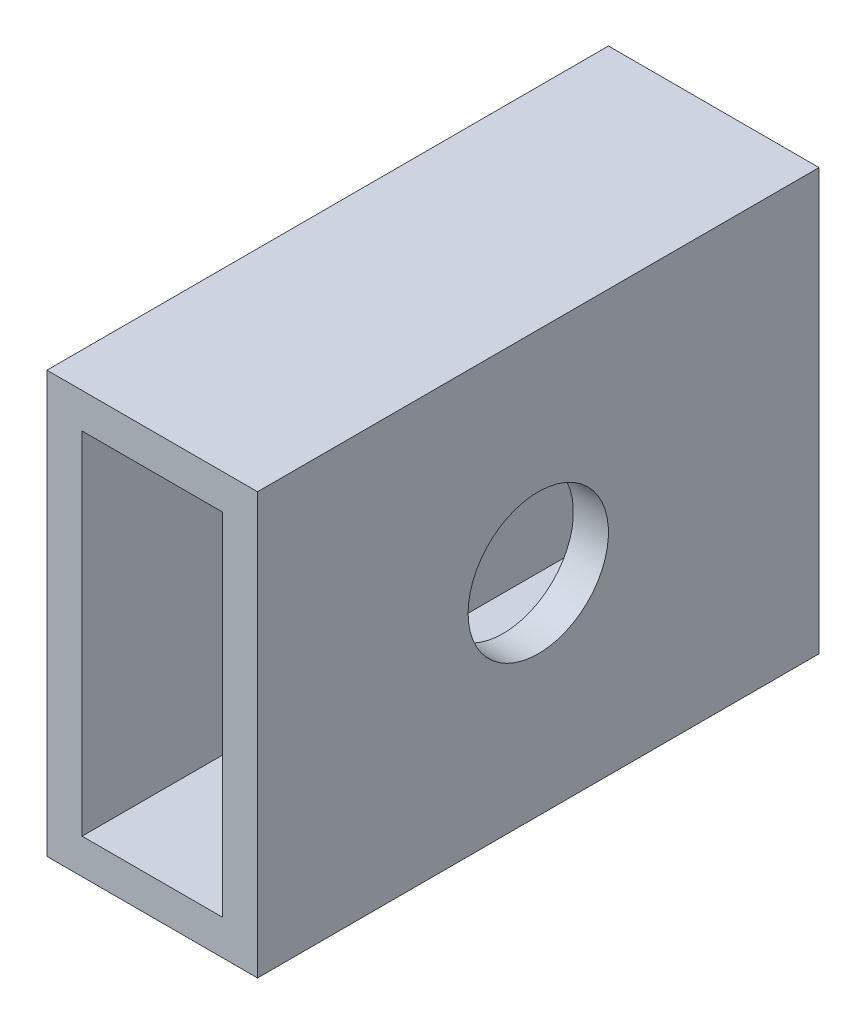
ISO-10303-21;
HEADER;
FILE_DESCRIPTION(('STEP AP214'),'2;1');
FILE_NAME('part.step','',(''),(''),'','','');
FILE_SCHEMA(('AUTOMOTIVE_DESIGN { 1 0 10303 214 1 1 1 1 }'));
ENDSEC;
DATA;
#1=APPLICATION_CONTEXT('core data for automotive mechanical design processes');
#2=APPLICATION_PROTOCOL_DEFINITION('international standard','automotive_design',2000,#1);
#3=PRODUCT_CONTEXT('',#1,'mechanical');
#4=PRODUCT('Part','Part','',(#3));
#5=PRODUCT_RELATED_PRODUCT_CATEGORY('part','',(#4));
#6=PRODUCT_DEFINITION_FORMATION('','',#4);
#7=PRODUCT_DEFINITION_CONTEXT('part definition',#1,'design');
#8=PRODUCT_DEFINITION('design','',#6,#7);
#9=PRODUCT_DEFINITION_SHAPE('','',#8);
#10=(LENGTH_UNIT() NAMED_UNIT(*) SI_UNIT(.MILLI.,.METRE.));
#11=(NAMED_UNIT(*) PLANE_ANGLE_UNIT() SI_UNIT($,.RADIAN.));
#12=(NAMED_UNIT(*) SI_UNIT($,.STERADIAN.) SOLID_ANGLE_UNIT());
#13=UNCERTAINTY_MEASURE_WITH_UNIT(LENGTH_MEASURE(1.E-05),#10,'distance_accuracy_value','');
#14=(GEOMETRIC_REPRESENTATION_CONTEXT(3) GLOBAL_UNCERTAINTY_ASSIGNED_CONTEXT((#13)) GLOBAL_UNIT_ASSIGNED_CONTEXT((#10,
#11,#12)) REPRESENTATION_CONTEXT('',''));
#15=CARTESIAN_POINT('',(0.,0.,0.));
#16=DIRECTION('',(0.,0.,1.));
#17=DIRECTION('',(1.,0.,0.));
#18=AXIS2_PLACEMENT_3D('',#15,#16,#17);
#19=CARTESIAN_POINT('',(0.,0.,50.8));
#20=DIRECTION('',(0.,0.,1.));
#21=DIRECTION('',(1.,0.,0.));
#22=AXIS2_PLACEMENT_3D('',#19,#20,#21);
#23=PLANE('',#22);
#24=DIRECTION('',(0.,-1.,0.));
#25=VECTOR('',#24,1.);
#26=CARTESIAN_POINT('',(0.,0.,50.8));
#27=LINE('',#26,#25);
#28=CARTESIAN_POINT('',(0.,38.1,50.8));
#29=VERTEX_POINT('',#28);
#30=CARTESIAN_POINT('',(0.,0.,50.8));
#31=VERTEX_POINT('',#30);
#32=EDGE_CURVE('E160',#29,#31,#27,.T.);
#33=ORIENTED_EDGE('',*,*,#32,.T.);
#34=DIRECTION('',(1.,0.,0.));
#35=VECTOR('',#34,1.);
#36=CARTESIAN_POINT('',(0.,0.,50.8));
#37=LINE('',#36,#35);
#38=CARTESIAN_POINT('',(19.05,0.,50.8));
#39=VERTEX_POINT('',#38);
#40=EDGE_CURVE('E163',#31,#39,#37,.T.);
#41=ORIENTED_EDGE('',*,*,#40,.T.);
#42=DIRECTION('',(0.,1.,0.));
#43=VECTOR('',#42,1.);
#44=CARTESIAN_POINT('',(19.05,0.,50.8));
#45=LINE('',#44,#43);
#46=CARTESIAN_POINT('',(19.05,38.1,50.8));
#47=VERTEX_POINT('',#46);
#48=EDGE_CURVE('E166',#39,#47,#45,.T.);
#49=ORIENTED_EDGE('',*,*,#48,.T.);
#50=DIRECTION('',(-1.,0.,0.));
#51=VECTOR('',#50,1.);
#52=CARTESIAN_POINT('',(0.,38.1,50.8));
#53=LINE('',#52,#51);
#54=EDGE_CURVE('E168',#47,#29,#53,.T.);
#55=ORIENTED_EDGE('',*,*,#54,.T.);
#56=EDGE_LOOP('',(#33,#41,#49,#55));
#57=FACE_BOUND('',#56,.T.);
#58=DIRECTION('',(1.,0.,0.));
#59=VECTOR('',#58,1.);
#60=CARTESIAN_POINT('',(0.,3.175,50.8));
#61=LINE('',#60,#59);
#62=CARTESIAN_POINT('',(3.175,3.175,50.8));
#63=VERTEX_POINT('',#62);
#64=CARTESIAN_POINT('',(15.875,3.175,50.8));
#65=VERTEX_POINT('',#64);
#66=EDGE_CURVE('E130',#63,#65,#61,.T.);
#67=ORIENTED_EDGE('',*,*,#66,.F.);
#68=DIRECTION('',(0.,-1.,0.));
#69=VECTOR('',#68,1.);
#70=CARTESIAN_POINT('',(3.175,0.,50.8));
#71=LINE('',#70,#69);
#72=CARTESIAN_POINT('',(3.175,34.925,50.8));
#73=VERTEX_POINT('',#72);
#74=EDGE_CURVE('E122',#73,#63,#71,.T.);
#75=ORIENTED_EDGE('',*,*,#74,.F.);
#76=DIRECTION('',(-1.,0.,0.));
#77=VECTOR('',#76,1.);
#78=CARTESIAN_POINT('',(0.,34.925,50.8));
#79=LINE('',#78,#77);
#80=CARTESIAN_POINT('',(15.875,34.925,50.8));
#81=VERTEX_POINT('',#80);
#82=EDGE_CURVE('E144',#81,#73,#79,.T.);
#83=ORIENTED_EDGE('',*,*,#82,.F.);
#84=DIRECTION('',(0.,1.,0.));
#85=VECTOR('',#84,1.);
#86=CARTESIAN_POINT('',(15.875,0.,50.8));
#87=LINE('',#86,#85);
#88=EDGE_CURVE('E142',#65,#81,#87,.T.);
#89=ORIENTED_EDGE('',*,*,#88,.F.);
#90=EDGE_LOOP('',(#67,#75,#83,#89));
#91=FACE_BOUND('',#90,.T.);
#92=ADVANCED_FACE('F56',(#57,#91),#23,.T.);
#93=CARTESIAN_POINT('',(0.,0.,0.));
#94=DIRECTION('',(0.,0.,1.));
#95=DIRECTION('',(1.,0.,0.));
#96=AXIS2_PLACEMENT_3D('',#93,#94,#95);
#97=PLANE('',#96);
#98=DIRECTION('',(0.,-1.,0.));
#99=VECTOR('',#98,1.);
#100=CARTESIAN_POINT('',(0.,0.,0.));
#101=LINE('',#100,#99);
#102=CARTESIAN_POINT('',(0.,38.1,0.));
#103=VERTEX_POINT('',#102);
#104=CARTESIAN_POINT('',(0.,0.,0.));
#105=VERTEX_POINT('',#104);
#106=EDGE_CURVE('E138',#103,#105,#101,.T.);
#107=ORIENTED_EDGE('',*,*,#106,.F.);
#108=DIRECTION('',(-1.,0.,0.));
#109=VECTOR('',#108,1.);
#110=CARTESIAN_POINT('',(0.,38.1,0.));
#111=LINE('',#110,#109);
#112=CARTESIAN_POINT('',(19.05,38.1,0.));
#113=VERTEX_POINT('',#112);
#114=EDGE_CURVE('E164',#113,#103,#111,.T.);
#115=ORIENTED_EDGE('',*,*,#114,.F.);
#116=DIRECTION('',(0.,1.,0.));
#117=VECTOR('',#116,1.);
#118=CARTESIAN_POINT('',(19.05,0.,0.));
#119=LINE('',#118,#117);
#120=CARTESIAN_POINT('',(19.05,0.,0.));
#121=VERTEX_POINT('',#120);
#122=EDGE_CURVE('E175',#121,#113,#119,.T.);
#123=ORIENTED_EDGE('',*,*,#122,.F.);
#124=DIRECTION('',(1.,0.,0.));
#125=VECTOR('',#124,1.);
#126=CARTESIAN_POINT('',(0.,0.,0.));
#127=LINE('',#126,#125);
#128=EDGE_CURVE('E173',#105,#121,#127,.T.);
#129=ORIENTED_EDGE('',*,*,#128,.F.);
#130=EDGE_LOOP('',(#107,#115,#123,#129));
#131=FACE_BOUND('',#130,.T.);
#132=DIRECTION('',(0.,-1.,0.));
#133=VECTOR('',#132,1.);
#134=CARTESIAN_POINT('',(3.175,0.,0.));
#135=LINE('',#134,#133);
#136=CARTESIAN_POINT('',(3.175,34.925,0.));
#137=VERTEX_POINT('',#136);
#138=CARTESIAN_POINT('',(3.175,3.175,0.));
#139=VERTEX_POINT('',#138);
#140=EDGE_CURVE('E80',#137,#139,#135,.T.);
#141=ORIENTED_EDGE('',*,*,#140,.T.);
#142=DIRECTION('',(1.,0.,0.));
#143=VECTOR('',#142,1.);
#144=CARTESIAN_POINT('',(0.,3.175,0.));
#145=LINE('',#144,#143);
#146=CARTESIAN_POINT('',(15.875,3.175,0.));
#147=VERTEX_POINT('',#146);
#148=EDGE_CURVE('E137',#139,#147,#145,.T.);
#149=ORIENTED_EDGE('',*,*,#148,.T.);
#150=DIRECTION('',(0.,1.,0.));
#151=VECTOR('',#150,1.);
#152=CARTESIAN_POINT('',(15.875,0.,0.));
#153=LINE('',#152,#151);
#154=CARTESIAN_POINT('',(15.875,34.925,0.));
#155=VERTEX_POINT('',#154);
#156=EDGE_CURVE('E152',#147,#155,#153,.T.);
#157=ORIENTED_EDGE('',*,*,#156,.T.);
#158=DIRECTION('',(-1.,0.,0.));
#159=VECTOR('',#158,1.);
#160=CARTESIAN_POINT('',(0.,34.925,0.));
#161=LINE('',#160,#159);
#162=EDGE_CURVE('E131',#155,#137,#161,.T.);
#163=ORIENTED_EDGE('',*,*,#162,.T.);
#164=EDGE_LOOP('',(#141,#149,#157,#163));
#165=FACE_BOUND('',#164,.T.);
#166=ADVANCED_FACE('F194',(#131,#165),#97,.F.);
#167=CARTESIAN_POINT('',(0.,0.,50.8));
#168=DIRECTION('',(1.,0.,0.));
#169=DIRECTION('',(0.,0.,-1.));
#170=AXIS2_PLACEMENT_3D('',#167,#168,#169);
#171=PLANE('',#170);
#172=CARTESIAN_POINT('',(0.,19.05,25.4));
#173=DIRECTION('',(-1.,0.,0.));
#174=DIRECTION('',(0.,0.,1.));
#175=AXIS2_PLACEMENT_3D('',#172,#173,#174);
#176=CIRCLE('',#175,6.35);
#177=CARTESIAN_POINT('',(0.,19.05,31.75));
#178=VERTEX_POINT('',#177);
#179=EDGE_CURVE('E237',#178,#178,#176,.T.);
#180=ORIENTED_EDGE('',*,*,#179,.F.);
#181=EDGE_LOOP('',(#180));
#182=FACE_BOUND('',#181,.T.);
#183=ORIENTED_EDGE('',*,*,#106,.T.);
#184=DIRECTION('',(0.,0.,-1.));
#185=VECTOR('',#184,1.);
#186=CARTESIAN_POINT('',(0.,0.,50.8));
#187=LINE('',#186,#185);
#188=EDGE_CURVE('E12',#31,#105,#187,.T.);
#189=ORIENTED_EDGE('',*,*,#188,.F.);
#190=ORIENTED_EDGE('',*,*,#32,.F.);
#191=DIRECTION('',(0.,0.,-1.));
#192=VECTOR('',#191,1.);
#193=CARTESIAN_POINT('',(0.,38.1,50.8));
#194=LINE('',#193,#192);
#195=EDGE_CURVE('E170',#29,#103,#194,.T.);
#196=ORIENTED_EDGE('',*,*,#195,.T.);
#197=EDGE_LOOP('',(#183,#189,#190,#196));
#198=FACE_BOUND('',#197,.T.);
#199=ADVANCED_FACE('F58',(#182,#198),#171,.F.);
#200=CARTESIAN_POINT('',(0.,0.,50.8));
#201=DIRECTION('',(0.,1.,0.));
#202=DIRECTION('',(0.,0.,1.));
#203=AXIS2_PLACEMENT_3D('',#200,#201,#202);
#204=PLANE('',#203);
#205=ORIENTED_EDGE('',*,*,#128,.T.);
#206=DIRECTION('',(0.,0.,-1.));
#207=VECTOR('',#206,1.);
#208=CARTESIAN_POINT('',(19.05,0.,50.8));
#209=LINE('',#208,#207);
#210=EDGE_CURVE('E65',#39,#121,#209,.T.);
#211=ORIENTED_EDGE('',*,*,#210,.F.);
#212=ORIENTED_EDGE('',*,*,#40,.F.);
#213=ORIENTED_EDGE('',*,*,#188,.T.);
#214=EDGE_LOOP('',(#205,#211,#212,#213));
#215=FACE_BOUND('',#214,.T.);
#216=ADVANCED_FACE('F204',(#215),#204,.F.);
#217=CARTESIAN_POINT('',(19.05,0.,50.8));
#218=DIRECTION('',(-1.,0.,0.));
#219=DIRECTION('',(0.,0.,1.));
#220=AXIS2_PLACEMENT_3D('',#217,#218,#219);
#221=PLANE('',#220);
#222=CARTESIAN_POINT('',(19.05,19.05,25.4));
#223=DIRECTION('',(-1.,0.,0.));
#224=DIRECTION('',(0.,0.,1.));
#225=AXIS2_PLACEMENT_3D('',#222,#223,#224);
#226=CIRCLE('',#225,6.35);
#227=CARTESIAN_POINT('',(19.05,19.05,31.75));
#228=VERTEX_POINT('',#227);
#229=EDGE_CURVE('E235',#228,#228,#226,.T.);
#230=ORIENTED_EDGE('',*,*,#229,.T.);
#231=EDGE_LOOP('',(#230));
#232=FACE_BOUND('',#231,.T.);
#233=ORIENTED_EDGE('',*,*,#122,.T.);
#234=DIRECTION('',(0.,0.,-1.));
#235=VECTOR('',#234,1.);
#236=CARTESIAN_POINT('',(19.05,38.1,50.8));
#237=LINE('',#236,#235);
#238=EDGE_CURVE('E180',#47,#113,#237,.T.);
#239=ORIENTED_EDGE('',*,*,#238,.F.);
#240=ORIENTED_EDGE('',*,*,#48,.F.);
#241=ORIENTED_EDGE('',*,*,#210,.T.);
#242=EDGE_LOOP('',(#233,#239,#240,#241));
#243=FACE_BOUND('',#242,.T.);
#244=ADVANCED_FACE('F188',(#232,#243),#221,.F.);
#245=CARTESIAN_POINT('',(0.,38.1,50.8));
#246=DIRECTION('',(0.,-1.,0.));
#247=DIRECTION('',(0.,0.,-1.));
#248=AXIS2_PLACEMENT_3D('',#245,#246,#247);
#249=PLANE('',#248);
#250=ORIENTED_EDGE('',*,*,#114,.T.);
#251=ORIENTED_EDGE('',*,*,#195,.F.);
#252=ORIENTED_EDGE('',*,*,#54,.F.);
#253=ORIENTED_EDGE('',*,*,#238,.T.);
#254=EDGE_LOOP('',(#250,#251,#252,#253));
#255=FACE_BOUND('',#254,.T.);
#256=ADVANCED_FACE('F198',(#255),#249,.F.);
#257=CARTESIAN_POINT('',(3.175,0.,50.8));
#258=DIRECTION('',(1.,0.,0.));
#259=DIRECTION('',(0.,0.,-1.));
#260=AXIS2_PLACEMENT_3D('',#257,#258,#259);
#261=PLANE('',#260);
#262=CARTESIAN_POINT('',(3.175,19.05,25.4));
#263=DIRECTION('',(1.,0.,0.));
#264=DIRECTION('',(0.,0.,-1.));
#265=AXIS2_PLACEMENT_3D('',#262,#263,#264);
#266=CIRCLE('',#265,6.35);
#267=CARTESIAN_POINT('',(3.175,19.05,31.75));
#268=VERTEX_POINT('',#267);
#269=EDGE_CURVE('E150',#268,#268,#266,.T.);
#270=ORIENTED_EDGE('',*,*,#269,.F.);
#271=EDGE_LOOP('',(#270));
#272=FACE_BOUND('',#271,.T.);
#273=ORIENTED_EDGE('',*,*,#140,.F.);
#274=DIRECTION('',(0.,0.,-1.));
#275=VECTOR('',#274,1.);
#276=CARTESIAN_POINT('',(3.175,34.925,50.8));
#277=LINE('',#276,#275);
#278=EDGE_CURVE('E126',#73,#137,#277,.T.);
#279=ORIENTED_EDGE('',*,*,#278,.F.);
#280=ORIENTED_EDGE('',*,*,#74,.T.);
#281=DIRECTION('',(0.,0.,-1.));
#282=VECTOR('',#281,1.);
#283=CARTESIAN_POINT('',(3.175,3.175,50.8));
#284=LINE('',#283,#282);
#285=EDGE_CURVE('E125',#63,#139,#284,.T.);
#286=ORIENTED_EDGE('',*,*,#285,.T.);
#287=EDGE_LOOP('',(#273,#279,#280,#286));
#288=FACE_BOUND('',#287,.T.);
#289=ADVANCED_FACE('F124',(#272,#288),#261,.T.);
#290=CARTESIAN_POINT('',(0.,3.175,50.8));
#291=DIRECTION('',(0.,1.,0.));
#292=DIRECTION('',(0.,0.,1.));
#293=AXIS2_PLACEMENT_3D('',#290,#291,#292);
#294=PLANE('',#293);
#295=ORIENTED_EDGE('',*,*,#148,.F.);
#296=ORIENTED_EDGE('',*,*,#285,.F.);
#297=ORIENTED_EDGE('',*,*,#66,.T.);
#298=DIRECTION('',(0.,0.,-1.));
#299=VECTOR('',#298,1.);
#300=CARTESIAN_POINT('',(15.875,3.175,50.8));
#301=LINE('',#300,#299);
#302=EDGE_CURVE('E139',#65,#147,#301,.T.);
#303=ORIENTED_EDGE('',*,*,#302,.T.);
#304=EDGE_LOOP('',(#295,#296,#297,#303));
#305=FACE_BOUND('',#304,.T.);
#306=ADVANCED_FACE('F134',(#305),#294,.T.);
#307=CARTESIAN_POINT('',(15.875,0.,50.8));
#308=DIRECTION('',(-1.,0.,0.));
#309=DIRECTION('',(0.,0.,1.));
#310=AXIS2_PLACEMENT_3D('',#307,#308,#309);
#311=PLANE('',#310);
#312=CARTESIAN_POINT('',(15.875,19.05,25.4));
#313=DIRECTION('',(-1.,0.,0.));
#314=DIRECTION('',(0.,0.,1.));
#315=AXIS2_PLACEMENT_3D('',#312,#313,#314);
#316=CIRCLE('',#315,6.35);
#317=CARTESIAN_POINT('',(15.875,19.05,31.75));
#318=VERTEX_POINT('',#317);
#319=EDGE_CURVE('E60',#318,#318,#316,.T.);
#320=ORIENTED_EDGE('',*,*,#319,.F.);
#321=EDGE_LOOP('',(#320));
#322=FACE_BOUND('',#321,.T.);
#323=ORIENTED_EDGE('',*,*,#156,.F.);
#324=ORIENTED_EDGE('',*,*,#302,.F.);
#325=ORIENTED_EDGE('',*,*,#88,.T.);
#326=DIRECTION('',(0.,0.,-1.));
#327=VECTOR('',#326,1.);
#328=CARTESIAN_POINT('',(15.875,34.925,50.8));
#329=LINE('',#328,#327);
#330=EDGE_CURVE('E72',#81,#155,#329,.T.);
#331=ORIENTED_EDGE('',*,*,#330,.T.);
#332=EDGE_LOOP('',(#323,#324,#325,#331));
#333=FACE_BOUND('',#332,.T.);
#334=ADVANCED_FACE('F230',(#322,#333),#311,.T.);
#335=CARTESIAN_POINT('',(0.,34.925,50.8));
#336=DIRECTION('',(0.,-1.,0.));
#337=DIRECTION('',(0.,0.,-1.));
#338=AXIS2_PLACEMENT_3D('',#335,#336,#337);
#339=PLANE('',#338);
#340=ORIENTED_EDGE('',*,*,#162,.F.);
#341=ORIENTED_EDGE('',*,*,#330,.F.);
#342=ORIENTED_EDGE('',*,*,#82,.T.);
#343=ORIENTED_EDGE('',*,*,#278,.T.);
#344=EDGE_LOOP('',(#340,#341,#342,#343));
#345=FACE_BOUND('',#344,.T.);
#346=ADVANCED_FACE('F246',(#345),#339,.T.);
#347=CARTESIAN_POINT('',(19.05,19.05,25.4));
#348=DIRECTION('',(-1.,0.,0.));
#349=DIRECTION('',(0.,0.,1.));
#350=AXIS2_PLACEMENT_3D('',#347,#348,#349);
#351=CYLINDRICAL_SURFACE('',#350,6.35);
#352=CARTESIAN_POINT('',(15.875,19.05,31.75));
#353=CARTESIAN_POINT('',(15.9080729166667,19.05,31.75));
#354=CARTESIAN_POINT('',(15.9411458333333,19.05,31.75));
#355=CARTESIAN_POINT('',(16.0072916666667,19.05,31.75));
#356=CARTESIAN_POINT('',(16.0403645833333,19.05,31.75));
#357=CARTESIAN_POINT('',(16.1065104166667,19.05,31.75));
#358=CARTESIAN_POINT('',(16.1395833333333,19.05,31.75));
#359=CARTESIAN_POINT('',(16.2057291666667,19.05,31.75));
#360=CARTESIAN_POINT('',(16.2388020833333,19.05,31.75));
#361=CARTESIAN_POINT('',(16.3049479166667,19.05,31.75));
#362=CARTESIAN_POINT('',(16.3380208333333,19.05,31.75));
#363=CARTESIAN_POINT('',(16.4041666666667,19.05,31.75));
#364=CARTESIAN_POINT('',(16.4372395833333,19.05,31.75));
#365=CARTESIAN_POINT('',(16.5033854166667,19.05,31.75));
#366=CARTESIAN_POINT('',(16.5364583333333,19.05,31.75));
#367=CARTESIAN_POINT('',(16.6026041666667,19.05,31.75));
#368=CARTESIAN_POINT('',(16.6356770833333,19.05,31.75));
#369=CARTESIAN_POINT('',(16.7018229166667,19.05,31.75));
#370=CARTESIAN_POINT('',(16.7348958333333,19.05,31.75));
#371=CARTESIAN_POINT('',(16.8010416666667,19.05,31.75));
#372=CARTESIAN_POINT('',(16.8341145833333,19.05,31.75));
#373=CARTESIAN_POINT('',(16.9002604166667,19.05,31.75));
#374=CARTESIAN_POINT('',(16.9333333333333,19.05,31.75));
#375=CARTESIAN_POINT('',(16.9994791666667,19.05,31.75));
#376=CARTESIAN_POINT('',(17.0325520833333,19.05,31.75));
#377=CARTESIAN_POINT('',(17.0986979166667,19.05,31.75));
#378=CARTESIAN_POINT('',(17.1317708333333,19.05,31.75));
#379=CARTESIAN_POINT('',(17.1979166666667,19.05,31.75));
#380=CARTESIAN_POINT('',(17.2309895833333,19.05,31.75));
#381=CARTESIAN_POINT('',(17.2971354166667,19.05,31.75));
#382=CARTESIAN_POINT('',(17.3302083333333,19.05,31.75));
#383=CARTESIAN_POINT('',(17.3963541666667,19.05,31.75));
#384=CARTESIAN_POINT('',(17.4294270833333,19.05,31.75));
#385=CARTESIAN_POINT('',(17.4955729166667,19.05,31.75));
#386=CARTESIAN_POINT('',(17.5286458333333,19.05,31.75));
#387=CARTESIAN_POINT('',(17.5947916666667,19.05,31.75));
#388=CARTESIAN_POINT('',(17.6278645833333,19.05,31.75));
#389=CARTESIAN_POINT('',(17.6940104166667,19.05,31.75));
#390=CARTESIAN_POINT('',(17.7270833333333,19.05,31.75));
#391=CARTESIAN_POINT('',(17.7932291666667,19.05,31.75));
#392=CARTESIAN_POINT('',(17.8263020833333,19.05,31.75));
#393=CARTESIAN_POINT('',(17.8924479166667,19.05,31.75));
#394=CARTESIAN_POINT('',(17.9255208333333,19.05,31.75));
#395=CARTESIAN_POINT('',(17.9916666666667,19.05,31.75));
#396=CARTESIAN_POINT('',(18.0247395833333,19.05,31.75));
#397=CARTESIAN_POINT('',(18.0908854166667,19.05,31.75));
#398=CARTESIAN_POINT('',(18.1239583333333,19.05,31.75));
#399=CARTESIAN_POINT('',(18.1901041666667,19.05,31.75));
#400=CARTESIAN_POINT('',(18.2231770833333,19.05,31.75));
#401=CARTESIAN_POINT('',(18.2893229166667,19.05,31.75));
#402=CARTESIAN_POINT('',(18.3223958333333,19.05,31.75));
#403=CARTESIAN_POINT('',(18.3885416666667,19.05,31.75));
#404=CARTESIAN_POINT('',(18.4216145833333,19.05,31.75));
#405=CARTESIAN_POINT('',(18.4877604166667,19.05,31.75));
#406=CARTESIAN_POINT('',(18.5208333333333,19.05,31.75));
#407=CARTESIAN_POINT('',(18.5869791666667,19.05,31.75));
#408=CARTESIAN_POINT('',(18.6200520833333,19.05,31.75));
#409=CARTESIAN_POINT('',(18.6861979166667,19.05,31.75));
#410=CARTESIAN_POINT('',(18.7192708333333,19.05,31.75));
#411=CARTESIAN_POINT('',(18.7854166666667,19.05,31.75));
#412=CARTESIAN_POINT('',(18.8184895833333,19.05,31.75));
#413=CARTESIAN_POINT('',(18.8846354166667,19.05,31.75));
#414=CARTESIAN_POINT('',(18.9177083333333,19.05,31.75));
#415=CARTESIAN_POINT('',(18.9838541666667,19.05,31.75));
#416=CARTESIAN_POINT('',(19.0169270833333,19.05,31.75));
#417=CARTESIAN_POINT('',(19.05,19.05,31.75));
#418=B_SPLINE_CURVE_WITH_KNOTS('',3,(#352,#353,#354,#355,#356,#357,#358,#359,#360,#361,#362,
#363,#364,#365,#366,#367,#368,#369,#370,#371,#372,#373,#374,#375,#376,#377,#378,#379,#380,#381,
#382,#383,#384,#385,#386,#387,#388,#389,#390,#391,#392,#393,#394,#395,#396,#397,#398,#399,#400,
#401,#402,#403,#404,#405,#406,#407,#408,#409,#410,#411,#412,#413,#414,#415,#416,#417),
.UNSPECIFIED.,.F.,.F.,(4,2,2,2,2,2,2,2,2,2,2,2,2,2,2,2,2,2,2,2,2,2,2,2,2,2,2,2,2,2,2,2,4),(0.,
0.0992187499999977,0.198437499999999,0.29765625,0.396874999999998,0.496093749999999,0.5953125,
0.694531249999998,0.793749999999999,0.892968749999997,0.992187499999998,1.09140625,1.190625,
1.28984375,1.3890625,1.48828125,1.5875,1.68671875,1.7859375,1.88515625,1.984375,2.08359375,
2.1828125,2.28203125,2.38125,2.48046875,2.5796875,2.67890625,2.778125,2.87734375,2.9765625,
3.07578125,3.175),.UNSPECIFIED.);
#419=EDGE_CURVE('BSEAM243',#318,#228,#418,.T.);
#420=ORIENTED_EDGE('',*,*,#319,.T.);
#421=ORIENTED_EDGE('',*,*,#229,.F.);
#422=ORIENTED_EDGE('',*,*,#419,.T.);
#423=ORIENTED_EDGE('',*,*,#419,.F.);
#424=EDGE_LOOP('',(#420,#422,#421,#423));
#425=FACE_BOUND('',#424,.T.);
#426=ADVANCED_FACE('F243',(#425),#351,.F.);
#427=CARTESIAN_POINT('',(3.175,19.05,31.75));
#428=CARTESIAN_POINT('',(3.14192708333333,19.05,31.75));
#429=CARTESIAN_POINT('',(3.10885416666666,19.05,31.75));
#430=CARTESIAN_POINT('',(3.04270833333333,19.05,31.75));
#431=CARTESIAN_POINT('',(3.00963541666666,19.05,31.75));
#432=CARTESIAN_POINT('',(2.94348958333333,19.05,31.75));
#433=CARTESIAN_POINT('',(2.91041666666666,19.05,31.75));
#434=CARTESIAN_POINT('',(2.84427083333333,19.05,31.75));
#435=CARTESIAN_POINT('',(2.81119791666667,19.05,31.75));
#436=CARTESIAN_POINT('',(2.74505208333333,19.05,31.75));
#437=CARTESIAN_POINT('',(2.71197916666667,19.05,31.75));
#438=CARTESIAN_POINT('',(2.64583333333333,19.05,31.75));
#439=CARTESIAN_POINT('',(2.61276041666666,19.05,31.75));
#440=CARTESIAN_POINT('',(2.54661458333333,19.05,31.75));
#441=CARTESIAN_POINT('',(2.51354166666667,19.05,31.75));
#442=CARTESIAN_POINT('',(2.44739583333333,19.05,31.75));
#443=CARTESIAN_POINT('',(2.41432291666667,19.05,31.75));
#444=CARTESIAN_POINT('',(2.34817708333333,19.05,31.75));
#445=CARTESIAN_POINT('',(2.31510416666666,19.05,31.75));
#446=CARTESIAN_POINT('',(2.24895833333333,19.05,31.75));
#447=CARTESIAN_POINT('',(2.21588541666666,19.05,31.75));
#448=CARTESIAN_POINT('',(2.14973958333333,19.05,31.75));
#449=CARTESIAN_POINT('',(2.11666666666666,19.05,31.75));
#450=CARTESIAN_POINT('',(2.05052083333333,19.05,31.75));
#451=CARTESIAN_POINT('',(2.01744791666666,19.05,31.75));
#452=CARTESIAN_POINT('',(1.95130208333333,19.05,31.75));
#453=CARTESIAN_POINT('',(1.91822916666666,19.05,31.75));
#454=CARTESIAN_POINT('',(1.85208333333333,19.05,31.75));
#455=CARTESIAN_POINT('',(1.81901041666666,19.05,31.75));
#456=CARTESIAN_POINT('',(1.75286458333333,19.05,31.75));
#457=CARTESIAN_POINT('',(1.71979166666667,19.05,31.75));
#458=CARTESIAN_POINT('',(1.65364583333333,19.05,31.75));
#459=CARTESIAN_POINT('',(1.62057291666667,19.05,31.75));
#460=CARTESIAN_POINT('',(1.55442708333333,19.05,31.75));
#461=CARTESIAN_POINT('',(1.52135416666666,19.05,31.75));
#462=CARTESIAN_POINT('',(1.45520833333333,19.05,31.75));
#463=CARTESIAN_POINT('',(1.42213541666667,19.05,31.75));
#464=CARTESIAN_POINT('',(1.35598958333333,19.05,31.75));
#465=CARTESIAN_POINT('',(1.32291666666667,19.05,31.75));
#466=CARTESIAN_POINT('',(1.25677083333333,19.05,31.75));
#467=CARTESIAN_POINT('',(1.22369791666667,19.05,31.75));
#468=CARTESIAN_POINT('',(1.15755208333333,19.05,31.75));
#469=CARTESIAN_POINT('',(1.12447916666667,19.05,31.75));
#470=CARTESIAN_POINT('',(1.05833333333333,19.05,31.75));
#471=CARTESIAN_POINT('',(1.02526041666667,19.05,31.75));
#472=CARTESIAN_POINT('',(0.959114583333332,19.05,31.75));
#473=CARTESIAN_POINT('',(0.926041666666666,19.05,31.75));
#474=CARTESIAN_POINT('',(0.859895833333334,19.05,31.75));
#475=CARTESIAN_POINT('',(0.826822916666666,19.05,31.75));
#476=CARTESIAN_POINT('',(0.760677083333332,19.05,31.75));
#477=CARTESIAN_POINT('',(0.727604166666665,19.05,31.75));
#478=CARTESIAN_POINT('',(0.661458333333332,19.05,31.75));
#479=CARTESIAN_POINT('',(0.628385416666666,19.05,31.75));
#480=CARTESIAN_POINT('',(0.562239583333333,19.05,31.75));
#481=CARTESIAN_POINT('',(0.529166666666666,19.05,31.75));
#482=CARTESIAN_POINT('',(0.463020833333332,19.05,31.75));
#483=CARTESIAN_POINT('',(0.429947916666665,19.05,31.75));
#484=CARTESIAN_POINT('',(0.363802083333332,19.05,31.75));
#485=CARTESIAN_POINT('',(0.330729166666666,19.05,31.75));
#486=CARTESIAN_POINT('',(0.264583333333333,19.05,31.75));
#487=CARTESIAN_POINT('',(0.231510416666666,19.05,31.75));
#488=CARTESIAN_POINT('',(0.165364583333333,19.05,31.75));
#489=CARTESIAN_POINT('',(0.132291666666667,19.05,31.75));
#490=CARTESIAN_POINT('',(0.0661458333333342,19.05,31.75));
#491=CARTESIAN_POINT('',(0.0330729166666671,19.05,31.75));
#492=CARTESIAN_POINT('',(0.,19.05,31.75));
#493=B_SPLINE_CURVE_WITH_KNOTS('',3,(#427,#428,#429,#430,#431,#432,#433,#434,#435,#436,#437,
#438,#439,#440,#441,#442,#443,#444,#445,#446,#447,#448,#449,#450,#451,#452,#453,#454,#455,#456,
#457,#458,#459,#460,#461,#462,#463,#464,#465,#466,#467,#468,#469,#470,#471,#472,#473,#474,#475,
#476,#477,#478,#479,#480,#481,#482,#483,#484,#485,#486,#487,#488,#489,#490,#491,#492),
.UNSPECIFIED.,.F.,.F.,(4,2,2,2,2,2,2,2,2,2,2,2,2,2,2,2,2,2,2,2,2,2,2,2,2,2,2,2,2,2,2,2,4),(0.,
0.0992187500000012,0.198437499999999,0.29765625,0.396874999999998,0.496093749999999,0.5953125,
0.694531249999998,0.793749999999999,0.892968750000001,0.992187499999998,1.09140625,1.190625,
1.28984375,1.3890625,1.48828125,1.5875,1.68671875,1.7859375,1.88515625,1.984375,2.08359375,
2.1828125,2.28203125,2.38125,2.48046875,2.5796875,2.67890625,2.778125,2.87734375,2.9765625,
3.07578125,3.175),.UNSPECIFIED.);
#494=EDGE_CURVE('BSEAM245',#268,#178,#493,.T.);
#495=ORIENTED_EDGE('',*,*,#269,.T.);
#496=ORIENTED_EDGE('',*,*,#179,.T.);
#497=ORIENTED_EDGE('',*,*,#494,.T.);
#498=ORIENTED_EDGE('',*,*,#494,.F.);
#499=EDGE_LOOP('',(#495,#497,#496,#498));
#500=FACE_BOUND('',#499,.T.);
#501=ADVANCED_FACE('F245',(#500),#351,.F.);
#502=CLOSED_SHELL('',(#92,#166,#199,#216,#244,#256,#289,#306,#334,#346,#426,#501));
#503=MANIFOLD_SOLID_BREP('B2',#502);
#504=ADVANCED_BREP_SHAPE_REPRESENTATION('',(#18,#503),#14);
#505=SHAPE_DEFINITION_REPRESENTATION(#9,#504);
ENDSEC;
END-ISO-10303-21;
